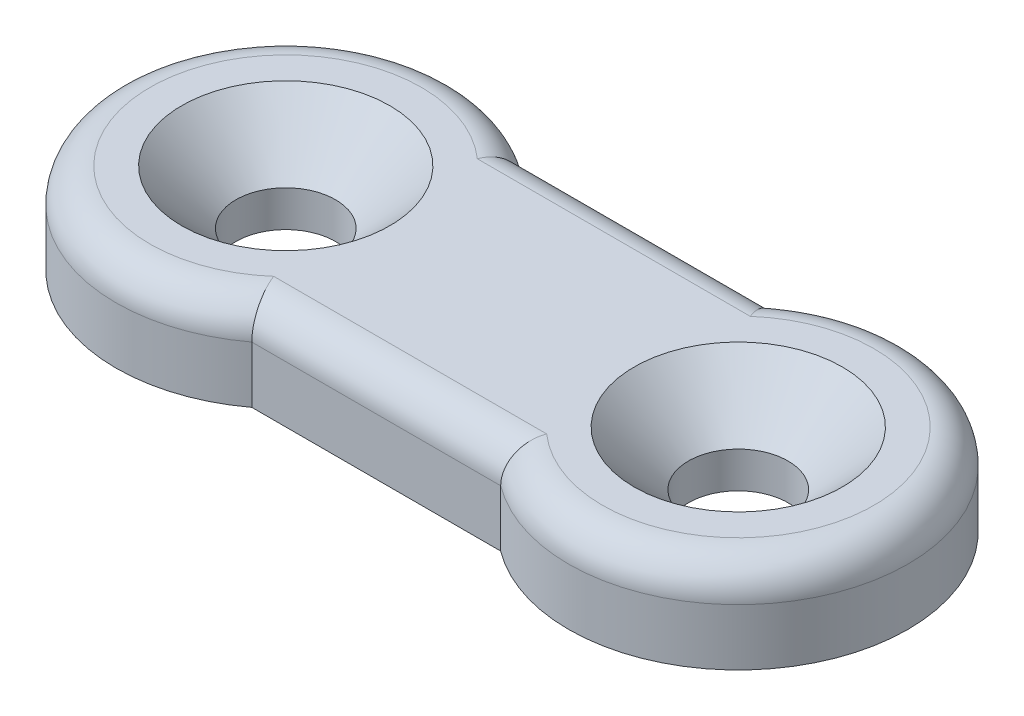
ISO-10303-21;
HEADER;
FILE_DESCRIPTION(('STEP AP214'),'2;1');
FILE_NAME('part.step','',(''),(''),'','','');
FILE_SCHEMA(('AUTOMOTIVE_DESIGN { 1 0 10303 214 1 1 1 1 }'));
ENDSEC;
DATA;
#1=APPLICATION_CONTEXT('core data for automotive mechanical design processes');
#2=APPLICATION_PROTOCOL_DEFINITION('international standard','automotive_design',2000,#1);
#3=PRODUCT_CONTEXT('',#1,'mechanical');
#4=PRODUCT('Part','Part','',(#3));
#5=PRODUCT_RELATED_PRODUCT_CATEGORY('part','',(#4));
#6=PRODUCT_DEFINITION_FORMATION('','',#4);
#7=PRODUCT_DEFINITION_CONTEXT('part definition',#1,'design');
#8=PRODUCT_DEFINITION('design','',#6,#7);
#9=PRODUCT_DEFINITION_SHAPE('','',#8);
#10=(LENGTH_UNIT() NAMED_UNIT(*) SI_UNIT(.MILLI.,.METRE.));
#11=(NAMED_UNIT(*) PLANE_ANGLE_UNIT() SI_UNIT($,.RADIAN.));
#12=(NAMED_UNIT(*) SI_UNIT($,.STERADIAN.) SOLID_ANGLE_UNIT());
#13=UNCERTAINTY_MEASURE_WITH_UNIT(LENGTH_MEASURE(1.E-05),#10,'distance_accuracy_value','');
#14=(GEOMETRIC_REPRESENTATION_CONTEXT(3) GLOBAL_UNCERTAINTY_ASSIGNED_CONTEXT((#13)) GLOBAL_UNIT_ASSIGNED_CONTEXT((#10,
#11,#12)) REPRESENTATION_CONTEXT('',''));
#15=CARTESIAN_POINT('',(0.,0.,0.));
#16=DIRECTION('',(0.,0.,1.));
#17=DIRECTION('',(1.,0.,0.));
#18=AXIS2_PLACEMENT_3D('',#15,#16,#17);
#19=CARTESIAN_POINT('',(-5.,2.,0.));
#20=DIRECTION('',(0.,1.,0.));
#21=DIRECTION('',(0.,0.,1.));
#22=AXIS2_PLACEMENT_3D('',#19,#20,#21);
#23=PLANE('',#22);
#24=CARTESIAN_POINT('',(-5.,2.,0.));
#25=DIRECTION('',(0.,1.,0.));
#26=DIRECTION('',(0.,0.,1.));
#27=AXIS2_PLACEMENT_3D('',#24,#25,#26);
#28=CIRCLE('',#27,3.);
#29=CARTESIAN_POINT('',(-3.01568651670156,2.,-2.25));
#30=VERTEX_POINT('',#29);
#31=CARTESIAN_POINT('',(-3.01568651670156,2.,2.25));
#32=VERTEX_POINT('',#31);
#33=EDGE_CURVE('E172',#30,#32,#28,.T.);
#34=ORIENTED_EDGE('',*,*,#33,.T.);
#35=DIRECTION('',(1.,0.,0.));
#36=VECTOR('',#35,1.);
#37=CARTESIAN_POINT('',(2.75,2.,2.25));
#38=LINE('',#37,#36);
#39=CARTESIAN_POINT('',(3.01568651670156,2.,2.25));
#40=VERTEX_POINT('',#39);
#41=EDGE_CURVE('E179',#32,#40,#38,.T.);
#42=ORIENTED_EDGE('',*,*,#41,.T.);
#43=CARTESIAN_POINT('',(5.,2.,0.));
#44=DIRECTION('',(0.,1.,0.));
#45=DIRECTION('',(0.,0.,1.));
#46=AXIS2_PLACEMENT_3D('',#43,#44,#45);
#47=CIRCLE('',#46,3.);
#48=CARTESIAN_POINT('',(3.01568651670156,2.,-2.25));
#49=VERTEX_POINT('',#48);
#50=EDGE_CURVE('E180',#40,#49,#47,.T.);
#51=ORIENTED_EDGE('',*,*,#50,.T.);
#52=DIRECTION('',(-1.,0.,0.));
#53=VECTOR('',#52,1.);
#54=CARTESIAN_POINT('',(-2.75,2.,-2.25));
#55=LINE('',#54,#53);
#56=EDGE_CURVE('E171',#49,#30,#55,.T.);
#57=ORIENTED_EDGE('',*,*,#56,.T.);
#58=EDGE_LOOP('',(#34,#42,#51,#57));
#59=FACE_BOUND('',#58,.T.);
#60=CARTESIAN_POINT('',(5.,2.,0.));
#61=DIRECTION('',(0.,1.,0.));
#62=DIRECTION('',(0.,0.,1.));
#63=AXIS2_PLACEMENT_3D('',#60,#61,#62);
#64=CIRCLE('',#63,2.3);
#65=CARTESIAN_POINT('',(5.,2.,2.3));
#66=VERTEX_POINT('',#65);
#67=EDGE_CURVE('E161',#66,#66,#64,.F.);
#68=ORIENTED_EDGE('',*,*,#67,.T.);
#69=EDGE_LOOP('',(#68));
#70=FACE_BOUND('',#69,.T.);
#71=CARTESIAN_POINT('',(-5.,2.,0.));
#72=DIRECTION('',(0.,1.,0.));
#73=DIRECTION('',(0.,0.,1.));
#74=AXIS2_PLACEMENT_3D('',#71,#72,#73);
#75=CIRCLE('',#74,2.3);
#76=CARTESIAN_POINT('',(-5.,2.,2.3));
#77=VERTEX_POINT('',#76);
#78=EDGE_CURVE('E157',#77,#77,#75,.F.);
#79=ORIENTED_EDGE('',*,*,#78,.T.);
#80=EDGE_LOOP('',(#79));
#81=FACE_BOUND('',#80,.T.);
#82=ADVANCED_FACE('F50',(#59,#70,#81),#23,.T.);
#83=CARTESIAN_POINT('',(-5.,0.,0.));
#84=DIRECTION('',(0.,1.,0.));
#85=DIRECTION('',(0.,0.,1.));
#86=AXIS2_PLACEMENT_3D('',#83,#84,#85);
#87=PLANE('',#86);
#88=DIRECTION('',(-1.,0.,0.));
#89=VECTOR('',#88,1.);
#90=CARTESIAN_POINT('',(-5.,0.,-3.));
#91=LINE('',#90,#89);
#92=CARTESIAN_POINT('',(2.75,0.,-3.));
#93=VERTEX_POINT('',#92);
#94=CARTESIAN_POINT('',(-2.75,0.,-3.));
#95=VERTEX_POINT('',#94);
#96=EDGE_CURVE('E110',#93,#95,#91,.T.);
#97=ORIENTED_EDGE('',*,*,#96,.F.);
#98=CARTESIAN_POINT('',(5.,0.,0.));
#99=DIRECTION('',(0.,1.,0.));
#100=DIRECTION('',(0.,0.,1.));
#101=AXIS2_PLACEMENT_3D('',#98,#99,#100);
#102=CIRCLE('',#101,3.75);
#103=CARTESIAN_POINT('',(2.75,0.,3.));
#104=VERTEX_POINT('',#103);
#105=EDGE_CURVE('E122',#93,#104,#102,.F.);
#106=ORIENTED_EDGE('',*,*,#105,.T.);
#107=DIRECTION('',(1.,0.,0.));
#108=VECTOR('',#107,1.);
#109=CARTESIAN_POINT('',(-5.,0.,3.));
#110=LINE('',#109,#108);
#111=CARTESIAN_POINT('',(-2.75,0.,3.));
#112=VERTEX_POINT('',#111);
#113=EDGE_CURVE('E123',#112,#104,#110,.T.);
#114=ORIENTED_EDGE('',*,*,#113,.F.);
#115=CARTESIAN_POINT('',(-5.,0.,0.));
#116=DIRECTION('',(0.,1.,0.));
#117=DIRECTION('',(0.,0.,1.));
#118=AXIS2_PLACEMENT_3D('',#115,#116,#117);
#119=CIRCLE('',#118,3.75);
#120=EDGE_CURVE('E124',#112,#95,#119,.F.);
#121=ORIENTED_EDGE('',*,*,#120,.T.);
#122=EDGE_LOOP('',(#97,#106,#114,#121));
#123=FACE_BOUND('',#122,.T.);
#124=CARTESIAN_POINT('',(-5.,0.,0.));
#125=DIRECTION('',(0.,1.,0.));
#126=DIRECTION('',(0.,0.,1.));
#127=AXIS2_PLACEMENT_3D('',#124,#125,#126);
#128=CIRCLE('',#127,1.1);
#129=CARTESIAN_POINT('',(-5.,0.,1.1));
#130=VERTEX_POINT('',#129);
#131=EDGE_CURVE('E150',#130,#130,#128,.T.);
#132=ORIENTED_EDGE('',*,*,#131,.T.);
#133=EDGE_LOOP('',(#132));
#134=FACE_BOUND('',#133,.T.);
#135=CARTESIAN_POINT('',(5.,0.,0.));
#136=DIRECTION('',(0.,1.,0.));
#137=DIRECTION('',(0.,0.,1.));
#138=AXIS2_PLACEMENT_3D('',#135,#136,#137);
#139=CIRCLE('',#138,1.1);
#140=CARTESIAN_POINT('',(5.,0.,1.1));
#141=VERTEX_POINT('',#140);
#142=EDGE_CURVE('E144',#141,#141,#139,.T.);
#143=ORIENTED_EDGE('',*,*,#142,.T.);
#144=EDGE_LOOP('',(#143));
#145=FACE_BOUND('',#144,.T.);
#146=ADVANCED_FACE('F117',(#123,#134,#145),#87,.F.);
#147=CARTESIAN_POINT('',(-5.,2.,3.));
#148=DIRECTION('',(0.,0.,-1.));
#149=DIRECTION('',(-1.,0.,0.));
#150=AXIS2_PLACEMENT_3D('',#147,#148,#149);
#151=PLANE('',#150);
#152=DIRECTION('',(0.,1.,0.));
#153=VECTOR('',#152,1.);
#154=CARTESIAN_POINT('',(2.75,-10.6066017177982,3.));
#155=LINE('',#154,#153);
#156=CARTESIAN_POINT('',(2.75,1.25,3.));
#157=VERTEX_POINT('',#156);
#158=EDGE_CURVE('E127',#104,#157,#155,.T.);
#159=ORIENTED_EDGE('',*,*,#158,.T.);
#160=DIRECTION('',(1.,0.,0.));
#161=VECTOR('',#160,1.);
#162=CARTESIAN_POINT('',(-2.75,1.25,3.));
#163=LINE('',#162,#161);
#164=CARTESIAN_POINT('',(-2.75,1.25,3.));
#165=VERTEX_POINT('',#164);
#166=EDGE_CURVE('E183',#157,#165,#163,.F.);
#167=ORIENTED_EDGE('',*,*,#166,.T.);
#168=DIRECTION('',(0.,1.,0.));
#169=VECTOR('',#168,1.);
#170=CARTESIAN_POINT('',(-2.75,-10.6066017177982,3.));
#171=LINE('',#170,#169);
#172=EDGE_CURVE('E142',#165,#112,#171,.F.);
#173=ORIENTED_EDGE('',*,*,#172,.T.);
#174=ORIENTED_EDGE('',*,*,#113,.T.);
#175=EDGE_LOOP('',(#159,#167,#173,#174));
#176=FACE_BOUND('',#175,.T.);
#177=ADVANCED_FACE('F232',(#176),#151,.F.);
#178=CARTESIAN_POINT('',(-5.,2.,-3.));
#179=DIRECTION('',(0.,0.,1.));
#180=DIRECTION('',(1.,0.,0.));
#181=AXIS2_PLACEMENT_3D('',#178,#179,#180);
#182=PLANE('',#181);
#183=DIRECTION('',(0.,1.,0.));
#184=VECTOR('',#183,1.);
#185=CARTESIAN_POINT('',(-2.75,-10.6066017177982,-3.));
#186=LINE('',#185,#184);
#187=CARTESIAN_POINT('',(-2.75,1.25,-3.));
#188=VERTEX_POINT('',#187);
#189=EDGE_CURVE('E113',#95,#188,#186,.T.);
#190=ORIENTED_EDGE('',*,*,#189,.T.);
#191=DIRECTION('',(-1.,0.,0.));
#192=VECTOR('',#191,1.);
#193=CARTESIAN_POINT('',(2.75,1.25,-3.));
#194=LINE('',#193,#192);
#195=CARTESIAN_POINT('',(2.75,1.25,-3.));
#196=VERTEX_POINT('',#195);
#197=EDGE_CURVE('E11',#188,#196,#194,.F.);
#198=ORIENTED_EDGE('',*,*,#197,.T.);
#199=DIRECTION('',(0.,1.,0.));
#200=VECTOR('',#199,1.);
#201=CARTESIAN_POINT('',(2.75,-10.6066017177982,-3.));
#202=LINE('',#201,#200);
#203=EDGE_CURVE('E104',#196,#93,#202,.F.);
#204=ORIENTED_EDGE('',*,*,#203,.T.);
#205=ORIENTED_EDGE('',*,*,#96,.T.);
#206=EDGE_LOOP('',(#190,#198,#204,#205));
#207=FACE_BOUND('',#206,.T.);
#208=ADVANCED_FACE('F106',(#207),#182,.F.);
#209=CARTESIAN_POINT('',(-5.,2.,0.));
#210=DIRECTION('',(0.,-1.,0.));
#211=DIRECTION('',(0.,0.,-1.));
#212=AXIS2_PLACEMENT_3D('',#209,#210,#211);
#213=CYLINDRICAL_SURFACE('',#212,1.1);
#214=CARTESIAN_POINT('',(-5.,0.800000000000006,0.));
#215=DIRECTION('',(0.,1.,0.));
#216=DIRECTION('',(0.,0.,1.));
#217=AXIS2_PLACEMENT_3D('',#214,#215,#216);
#218=CIRCLE('',#217,1.1);
#219=CARTESIAN_POINT('',(-5.,0.800000000000006,1.1));
#220=VERTEX_POINT('',#219);
#221=EDGE_CURVE('E170',#220,#220,#218,.T.);
#222=ORIENTED_EDGE('',*,*,#221,.T.);
#223=EDGE_LOOP('',(#222));
#224=FACE_BOUND('',#223,.T.);
#225=ORIENTED_EDGE('',*,*,#131,.F.);
#226=EDGE_LOOP('',(#225));
#227=FACE_BOUND('',#226,.T.);
#228=ADVANCED_FACE('F237',(#224,#227),#213,.F.);
#229=CARTESIAN_POINT('',(5.,2.,0.));
#230=DIRECTION('',(0.,-1.,0.));
#231=DIRECTION('',(0.,0.,-1.));
#232=AXIS2_PLACEMENT_3D('',#229,#230,#231);
#233=CYLINDRICAL_SURFACE('',#232,1.1);
#234=CARTESIAN_POINT('',(5.,0.800000000000006,0.));
#235=DIRECTION('',(0.,1.,0.));
#236=DIRECTION('',(0.,0.,1.));
#237=AXIS2_PLACEMENT_3D('',#234,#235,#236);
#238=CIRCLE('',#237,1.1);
#239=CARTESIAN_POINT('',(5.,0.800000000000006,1.1));
#240=VERTEX_POINT('',#239);
#241=EDGE_CURVE('E115',#240,#240,#238,.T.);
#242=ORIENTED_EDGE('',*,*,#241,.T.);
#243=EDGE_LOOP('',(#242));
#244=FACE_BOUND('',#243,.T.);
#245=ORIENTED_EDGE('',*,*,#142,.F.);
#246=EDGE_LOOP('',(#245));
#247=FACE_BOUND('',#246,.T.);
#248=ADVANCED_FACE('F262',(#244,#247),#233,.F.);
#249=CARTESIAN_POINT('',(-5.,-10.6066017177982,0.));
#250=DIRECTION('',(0.,1.,0.));
#251=DIRECTION('',(0.,0.,1.));
#252=AXIS2_PLACEMENT_3D('',#249,#250,#251);
#253=CYLINDRICAL_SURFACE('',#252,3.75);
#254=ORIENTED_EDGE('',*,*,#172,.F.);
#255=CARTESIAN_POINT('',(-5.,1.25,0.));
#256=DIRECTION('',(0.,1.,0.));
#257=DIRECTION('',(0.,0.,1.));
#258=AXIS2_PLACEMENT_3D('',#255,#256,#257);
#259=CIRCLE('',#258,3.75);
#260=EDGE_CURVE('E61',#165,#188,#259,.F.);
#261=ORIENTED_EDGE('',*,*,#260,.T.);
#262=ORIENTED_EDGE('',*,*,#189,.F.);
#263=ORIENTED_EDGE('',*,*,#120,.F.);
#264=EDGE_LOOP('',(#254,#261,#262,#263));
#265=FACE_BOUND('',#264,.T.);
#266=ADVANCED_FACE('F269',(#265),#253,.T.);
#267=CARTESIAN_POINT('',(5.,-10.6066017177982,0.));
#268=DIRECTION('',(0.,1.,0.));
#269=DIRECTION('',(0.,0.,1.));
#270=AXIS2_PLACEMENT_3D('',#267,#268,#269);
#271=CYLINDRICAL_SURFACE('',#270,3.75);
#272=ORIENTED_EDGE('',*,*,#203,.F.);
#273=CARTESIAN_POINT('',(5.,1.25,0.));
#274=DIRECTION('',(0.,1.,0.));
#275=DIRECTION('',(0.,0.,1.));
#276=AXIS2_PLACEMENT_3D('',#273,#274,#275);
#277=CIRCLE('',#276,3.75);
#278=EDGE_CURVE('E189',#196,#157,#277,.F.);
#279=ORIENTED_EDGE('',*,*,#278,.T.);
#280=ORIENTED_EDGE('',*,*,#158,.F.);
#281=ORIENTED_EDGE('',*,*,#105,.F.);
#282=EDGE_LOOP('',(#272,#279,#280,#281));
#283=FACE_BOUND('',#282,.T.);
#284=ADVANCED_FACE('F130',(#283),#271,.T.);
#285=CARTESIAN_POINT('',(5.,0.800000000000006,0.));
#286=DIRECTION('',(0.,1.,0.));
#287=DIRECTION('',(0.,0.,1.));
#288=AXIS2_PLACEMENT_3D('',#285,#286,#287);
#289=CONICAL_SURFACE('',#288,1.1,0.78539816339745);
#290=CARTESIAN_POINT('',(5.,2.,2.3));
#291=CARTESIAN_POINT('',(5.,1.9875,2.2875));
#292=CARTESIAN_POINT('',(5.,1.975,2.275));
#293=CARTESIAN_POINT('',(5.,1.95,2.25));
#294=CARTESIAN_POINT('',(5.,1.9375,2.2375));
#295=CARTESIAN_POINT('',(5.,1.9125,2.2125));
#296=CARTESIAN_POINT('',(5.,1.9,2.2));
#297=CARTESIAN_POINT('',(5.,1.875,2.175));
#298=CARTESIAN_POINT('',(5.,1.8625,2.1625));
#299=CARTESIAN_POINT('',(5.,1.8375,2.1375));
#300=CARTESIAN_POINT('',(5.,1.825,2.125));
#301=CARTESIAN_POINT('',(5.,1.8,2.1));
#302=CARTESIAN_POINT('',(5.,1.7875,2.0875));
#303=CARTESIAN_POINT('',(5.,1.7625,2.0625));
#304=CARTESIAN_POINT('',(5.,1.75,2.05));
#305=CARTESIAN_POINT('',(5.,1.725,2.025));
#306=CARTESIAN_POINT('',(5.,1.7125,2.0125));
#307=CARTESIAN_POINT('',(5.,1.6875,1.9875));
#308=CARTESIAN_POINT('',(5.,1.675,1.975));
#309=CARTESIAN_POINT('',(5.,1.65,1.95));
#310=CARTESIAN_POINT('',(5.,1.6375,1.9375));
#311=CARTESIAN_POINT('',(5.,1.6125,1.9125));
#312=CARTESIAN_POINT('',(5.,1.6,1.9));
#313=CARTESIAN_POINT('',(5.,1.575,1.875));
#314=CARTESIAN_POINT('',(5.,1.5625,1.8625));
#315=CARTESIAN_POINT('',(5.,1.5375,1.8375));
#316=CARTESIAN_POINT('',(5.,1.525,1.825));
#317=CARTESIAN_POINT('',(5.,1.5,1.8));
#318=CARTESIAN_POINT('',(5.,1.4875,1.7875));
#319=CARTESIAN_POINT('',(5.,1.4625,1.7625));
#320=CARTESIAN_POINT('',(5.,1.45,1.75));
#321=CARTESIAN_POINT('',(5.,1.425,1.725));
#322=CARTESIAN_POINT('',(5.,1.4125,1.7125));
#323=CARTESIAN_POINT('',(5.,1.3875,1.6875));
#324=CARTESIAN_POINT('',(5.,1.375,1.675));
#325=CARTESIAN_POINT('',(5.,1.35,1.65));
#326=CARTESIAN_POINT('',(5.,1.3375,1.6375));
#327=CARTESIAN_POINT('',(5.,1.3125,1.6125));
#328=CARTESIAN_POINT('',(5.,1.3,1.6));
#329=CARTESIAN_POINT('',(5.,1.275,1.575));
#330=CARTESIAN_POINT('',(5.,1.2625,1.5625));
#331=CARTESIAN_POINT('',(5.,1.2375,1.5375));
#332=CARTESIAN_POINT('',(5.,1.225,1.525));
#333=CARTESIAN_POINT('',(5.,1.2,1.5));
#334=CARTESIAN_POINT('',(5.,1.1875,1.4875));
#335=CARTESIAN_POINT('',(5.,1.1625,1.4625));
#336=CARTESIAN_POINT('',(5.,1.15,1.45));
#337=CARTESIAN_POINT('',(5.,1.125,1.425));
#338=CARTESIAN_POINT('',(5.,1.1125,1.4125));
#339=CARTESIAN_POINT('',(5.,1.0875,1.3875));
#340=CARTESIAN_POINT('',(5.,1.075,1.375));
#341=CARTESIAN_POINT('',(5.,1.05,1.35));
#342=CARTESIAN_POINT('',(5.,1.0375,1.3375));
#343=CARTESIAN_POINT('',(5.,1.0125,1.3125));
#344=CARTESIAN_POINT('',(5.,1.,1.3));
#345=CARTESIAN_POINT('',(5.,0.975000000000005,1.275));
#346=CARTESIAN_POINT('',(5.,0.962500000000005,1.2625));
#347=CARTESIAN_POINT('',(5.,0.937500000000005,1.2375));
#348=CARTESIAN_POINT('',(5.,0.925000000000005,1.225));
#349=CARTESIAN_POINT('',(5.,0.900000000000005,1.2));
#350=CARTESIAN_POINT('',(5.,0.887500000000005,1.1875));
#351=CARTESIAN_POINT('',(5.,0.862500000000005,1.1625));
#352=CARTESIAN_POINT('',(5.,0.850000000000005,1.15));
#353=CARTESIAN_POINT('',(5.,0.825000000000005,1.125));
#354=CARTESIAN_POINT('',(5.,0.812500000000005,1.1125));
#355=CARTESIAN_POINT('',(5.,0.800000000000006,1.1));
#356=B_SPLINE_CURVE_WITH_KNOTS('',3,(#290,#291,#292,#293,#294,#295,#296,#297,#298,#299,#300,
#301,#302,#303,#304,#305,#306,#307,#308,#309,#310,#311,#312,#313,#314,#315,#316,#317,#318,#319,
#320,#321,#322,#323,#324,#325,#326,#327,#328,#329,#330,#331,#332,#333,#334,#335,#336,#337,#338,
#339,#340,#341,#342,#343,#344,#345,#346,#347,#348,#349,#350,#351,#352,#353,#354,#355),
.UNSPECIFIED.,.F.,.F.,(4,2,2,2,2,2,2,2,2,2,2,2,2,2,2,2,2,2,2,2,2,2,2,2,2,2,2,2,2,2,2,2,4),(0.,
0.0530330085889911,0.106066017177982,0.159099025766973,0.212132034355964,0.265165042944954,
0.318198051533945,0.371231060122936,0.424264068711927,0.477297077300918,0.530330085889909,
0.5833630944789,0.636396103067891,0.689429111656881,0.742462120245872,0.795495128834863,
0.848528137423854,0.901561146012845,0.954594154601836,1.00762716319083,1.06066017177982,
1.11369318036881,1.1667261889578,1.21975919754679,1.27279220613578,1.32582521472477,
1.37885822331376,1.43189123190275,1.48492424049174,1.53795724908074,1.59099025766973,
1.64402326625872,1.69705627484771),.UNSPECIFIED.);
#357=EDGE_CURVE('BSEAM250',#66,#240,#356,.T.);
#358=ORIENTED_EDGE('',*,*,#67,.F.);
#359=ORIENTED_EDGE('',*,*,#241,.F.);
#360=ORIENTED_EDGE('',*,*,#357,.T.);
#361=ORIENTED_EDGE('',*,*,#357,.F.);
#362=EDGE_LOOP('',(#358,#360,#359,#361));
#363=FACE_BOUND('',#362,.T.);
#364=ADVANCED_FACE('F250',(#363),#289,.F.);
#365=CARTESIAN_POINT('',(-5.,0.800000000000006,0.));
#366=DIRECTION('',(0.,1.,0.));
#367=DIRECTION('',(0.,0.,1.));
#368=AXIS2_PLACEMENT_3D('',#365,#366,#367);
#369=CONICAL_SURFACE('',#368,1.1,0.78539816339745);
#370=CARTESIAN_POINT('',(-5.,2.,2.3));
#371=CARTESIAN_POINT('',(-5.,1.9875,2.2875));
#372=CARTESIAN_POINT('',(-5.,1.975,2.275));
#373=CARTESIAN_POINT('',(-5.,1.95,2.25));
#374=CARTESIAN_POINT('',(-5.,1.9375,2.2375));
#375=CARTESIAN_POINT('',(-5.,1.9125,2.2125));
#376=CARTESIAN_POINT('',(-5.,1.9,2.2));
#377=CARTESIAN_POINT('',(-5.,1.875,2.175));
#378=CARTESIAN_POINT('',(-5.,1.8625,2.1625));
#379=CARTESIAN_POINT('',(-5.,1.8375,2.1375));
#380=CARTESIAN_POINT('',(-5.,1.825,2.125));
#381=CARTESIAN_POINT('',(-5.,1.8,2.1));
#382=CARTESIAN_POINT('',(-5.,1.7875,2.0875));
#383=CARTESIAN_POINT('',(-5.,1.7625,2.0625));
#384=CARTESIAN_POINT('',(-5.,1.75,2.05));
#385=CARTESIAN_POINT('',(-5.,1.725,2.025));
#386=CARTESIAN_POINT('',(-5.,1.7125,2.0125));
#387=CARTESIAN_POINT('',(-5.,1.6875,1.9875));
#388=CARTESIAN_POINT('',(-5.,1.675,1.975));
#389=CARTESIAN_POINT('',(-5.,1.65,1.95));
#390=CARTESIAN_POINT('',(-5.,1.6375,1.9375));
#391=CARTESIAN_POINT('',(-5.,1.6125,1.9125));
#392=CARTESIAN_POINT('',(-5.,1.6,1.9));
#393=CARTESIAN_POINT('',(-5.,1.575,1.875));
#394=CARTESIAN_POINT('',(-5.,1.5625,1.8625));
#395=CARTESIAN_POINT('',(-5.,1.5375,1.8375));
#396=CARTESIAN_POINT('',(-5.,1.525,1.825));
#397=CARTESIAN_POINT('',(-5.,1.5,1.8));
#398=CARTESIAN_POINT('',(-5.,1.4875,1.7875));
#399=CARTESIAN_POINT('',(-5.,1.4625,1.7625));
#400=CARTESIAN_POINT('',(-5.,1.45,1.75));
#401=CARTESIAN_POINT('',(-5.,1.425,1.725));
#402=CARTESIAN_POINT('',(-5.,1.4125,1.7125));
#403=CARTESIAN_POINT('',(-5.,1.3875,1.6875));
#404=CARTESIAN_POINT('',(-5.,1.375,1.675));
#405=CARTESIAN_POINT('',(-5.,1.35,1.65));
#406=CARTESIAN_POINT('',(-5.,1.3375,1.6375));
#407=CARTESIAN_POINT('',(-5.,1.3125,1.6125));
#408=CARTESIAN_POINT('',(-5.,1.3,1.6));
#409=CARTESIAN_POINT('',(-5.,1.275,1.575));
#410=CARTESIAN_POINT('',(-5.,1.2625,1.5625));
#411=CARTESIAN_POINT('',(-5.,1.2375,1.5375));
#412=CARTESIAN_POINT('',(-5.,1.225,1.525));
#413=CARTESIAN_POINT('',(-5.,1.2,1.5));
#414=CARTESIAN_POINT('',(-5.,1.1875,1.4875));
#415=CARTESIAN_POINT('',(-5.,1.1625,1.4625));
#416=CARTESIAN_POINT('',(-5.,1.15,1.45));
#417=CARTESIAN_POINT('',(-5.,1.125,1.425));
#418=CARTESIAN_POINT('',(-5.,1.1125,1.4125));
#419=CARTESIAN_POINT('',(-5.,1.0875,1.3875));
#420=CARTESIAN_POINT('',(-5.,1.075,1.375));
#421=CARTESIAN_POINT('',(-5.,1.05,1.35));
#422=CARTESIAN_POINT('',(-5.,1.0375,1.3375));
#423=CARTESIAN_POINT('',(-5.,1.0125,1.3125));
#424=CARTESIAN_POINT('',(-5.,1.,1.3));
#425=CARTESIAN_POINT('',(-5.,0.975000000000005,1.275));
#426=CARTESIAN_POINT('',(-5.,0.962500000000005,1.2625));
#427=CARTESIAN_POINT('',(-5.,0.937500000000005,1.2375));
#428=CARTESIAN_POINT('',(-5.,0.925000000000005,1.225));
#429=CARTESIAN_POINT('',(-5.,0.900000000000005,1.2));
#430=CARTESIAN_POINT('',(-5.,0.887500000000005,1.1875));
#431=CARTESIAN_POINT('',(-5.,0.862500000000005,1.1625));
#432=CARTESIAN_POINT('',(-5.,0.850000000000005,1.15));
#433=CARTESIAN_POINT('',(-5.,0.825000000000005,1.125));
#434=CARTESIAN_POINT('',(-5.,0.812500000000005,1.1125));
#435=CARTESIAN_POINT('',(-5.,0.800000000000006,1.1));
#436=B_SPLINE_CURVE_WITH_KNOTS('',3,(#370,#371,#372,#373,#374,#375,#376,#377,#378,#379,#380,
#381,#382,#383,#384,#385,#386,#387,#388,#389,#390,#391,#392,#393,#394,#395,#396,#397,#398,#399,
#400,#401,#402,#403,#404,#405,#406,#407,#408,#409,#410,#411,#412,#413,#414,#415,#416,#417,#418,
#419,#420,#421,#422,#423,#424,#425,#426,#427,#428,#429,#430,#431,#432,#433,#434,#435),
.UNSPECIFIED.,.F.,.F.,(4,2,2,2,2,2,2,2,2,2,2,2,2,2,2,2,2,2,2,2,2,2,2,2,2,2,2,2,2,2,2,2,4),(0.,
0.0530330085889911,0.106066017177982,0.159099025766973,0.212132034355964,0.265165042944954,
0.318198051533945,0.371231060122936,0.424264068711927,0.477297077300918,0.530330085889909,
0.5833630944789,0.636396103067891,0.689429111656881,0.742462120245872,0.795495128834863,
0.848528137423854,0.901561146012845,0.954594154601836,1.00762716319083,1.06066017177982,
1.11369318036881,1.1667261889578,1.21975919754679,1.27279220613578,1.32582521472477,
1.37885822331376,1.43189123190275,1.48492424049174,1.53795724908074,1.59099025766973,
1.64402326625872,1.69705627484771),.UNSPECIFIED.);
#437=EDGE_CURVE('BSEAM224',#77,#220,#436,.T.);
#438=ORIENTED_EDGE('',*,*,#78,.F.);
#439=ORIENTED_EDGE('',*,*,#221,.F.);
#440=ORIENTED_EDGE('',*,*,#437,.T.);
#441=ORIENTED_EDGE('',*,*,#437,.F.);
#442=EDGE_LOOP('',(#438,#440,#439,#441));
#443=FACE_BOUND('',#442,.T.);
#444=ADVANCED_FACE('F224',(#443),#369,.F.);
#445=CARTESIAN_POINT('',(-5.,1.25,-2.25));
#446=DIRECTION('',(1.,0.,0.));
#447=DIRECTION('',(0.,0.,-1.));
#448=AXIS2_PLACEMENT_3D('',#445,#446,#447);
#449=CYLINDRICAL_SURFACE('',#448,0.75);
#450=CARTESIAN_POINT('',(2.75,1.25,-3.));
#451=CARTESIAN_POINT('',(2.74998905867986,1.29058370267292,-3.00004243921257));
#452=CARTESIAN_POINT('',(2.75109713085981,1.33114529022068,-2.99670875961219));
#453=CARTESIAN_POINT('',(2.75546644333195,1.41101579539589,-2.98361488319819));
#454=CARTESIAN_POINT('',(2.75872324746991,1.45032711934631,-2.97386792699618));
#455=CARTESIAN_POINT('',(2.76730587110689,1.52666568608426,-2.94827055562628));
#456=CARTESIAN_POINT('',(2.77263172990519,1.56369288547203,-2.93242002452812));
#457=CARTESIAN_POINT('',(2.78520469459627,1.63449261602701,-2.89518571716089));
#458=CARTESIAN_POINT('',(2.79245208326654,1.66826466715965,-2.87380112649587));
#459=CARTESIAN_POINT('',(2.80884708274731,1.73237133829751,-2.82572187690543));
#460=CARTESIAN_POINT('',(2.81802994112287,1.76262327796004,-2.79892917742853));
#461=CARTESIAN_POINT('',(2.8379774551548,1.81821509340858,-2.74116140298337));
#462=CARTESIAN_POINT('',(2.84874260526331,1.8435534279751,-2.71018502089771));
#463=CARTESIAN_POINT('',(2.87216355429324,1.88992120913573,-2.6433629125557));
#464=CARTESIAN_POINT('',(2.88488587990576,1.91068084939849,-2.60735355148422));
#465=CARTESIAN_POINT('',(2.91150109049323,1.94587556943367,-2.53276728278516));
#466=CARTESIAN_POINT('',(2.92539408598144,1.96031005130094,-2.49419013282624));
#467=CARTESIAN_POINT('',(2.95152433091159,1.98069513075811,-2.42240841352011));
#468=CARTESIAN_POINT('',(2.96362641587813,1.98768775946418,-2.38944366611599));
#469=CARTESIAN_POINT('',(2.98822235104004,1.99718251635412,-2.32306580191279));
#470=CARTESIAN_POINT('',(3.00071542413897,1.99969303954343,-2.28965364168525));
#471=CARTESIAN_POINT('',(3.01409959258152,1.999991201465,-2.25419985845682));
#472=CARTESIAN_POINT('',(3.01489287347166,2.00000002191533,-2.25209977376721));
#473=CARTESIAN_POINT('',(3.01568651670156,2.,-2.25));
#474=B_SPLINE_CURVE_WITH_KNOTS('',3,(#450,#451,#452,#453,#454,#455,#456,#457,#458,#459,#460,
#461,#462,#463,#464,#465,#466,#467,#468,#469,#470,#471,#472,#473),.UNSPECIFIED.,.F.,.F.,(4,2,2,
2,2,2,2,2,2,2,2,4),(0.,0.121565492442729,0.242880789514633,0.36419839094234,0.485533855712512,
0.609306739354865,0.733118383482231,0.862957257731765,0.992808402756185,1.09995800456309,
1.20690670325669,1.21364142216533),.UNSPECIFIED.);
#475=EDGE_CURVE('E140',#196,#49,#474,.T.);
#476=ORIENTED_EDGE('',*,*,#475,.F.);
#477=ORIENTED_EDGE('',*,*,#197,.F.);
#478=CARTESIAN_POINT('',(-2.75,1.25,-3.));
#479=CARTESIAN_POINT('',(-2.74998905867986,1.29058370267292,-3.00004243921257));
#480=CARTESIAN_POINT('',(-2.75109713085981,1.33114529022068,-2.99670875961219));
#481=CARTESIAN_POINT('',(-2.75546644333195,1.41101579539589,-2.98361488319819));
#482=CARTESIAN_POINT('',(-2.75872324746991,1.45032711934631,-2.97386792699618));
#483=CARTESIAN_POINT('',(-2.76730587110689,1.52666568608426,-2.94827055562628));
#484=CARTESIAN_POINT('',(-2.77263172990519,1.56369288547203,-2.93242002452812));
#485=CARTESIAN_POINT('',(-2.78520469459628,1.63449261602701,-2.89518571716089));
#486=CARTESIAN_POINT('',(-2.79245208326654,1.66826466715965,-2.87380112649587));
#487=CARTESIAN_POINT('',(-2.80884708274732,1.73237133829751,-2.82572187690543));
#488=CARTESIAN_POINT('',(-2.81802994112287,1.76262327796004,-2.79892917742853));
#489=CARTESIAN_POINT('',(-2.8379774551548,1.81821509340858,-2.74116140298336));
#490=CARTESIAN_POINT('',(-2.84874260526331,1.84355342797509,-2.71018502089771));
#491=CARTESIAN_POINT('',(-2.87216355429324,1.88992120913573,-2.6433629125557));
#492=CARTESIAN_POINT('',(-2.88488587990576,1.91068084939849,-2.60735355148422));
#493=CARTESIAN_POINT('',(-2.91150109049323,1.94587556943367,-2.53276728278516));
#494=CARTESIAN_POINT('',(-2.92539408598143,1.96031005130094,-2.49419013282624));
#495=CARTESIAN_POINT('',(-2.9515243309116,1.98069513075811,-2.42240841352011));
#496=CARTESIAN_POINT('',(-2.96362641587815,1.98768775946418,-2.389443666116));
#497=CARTESIAN_POINT('',(-2.98822235104002,1.99718251635412,-2.32306580191278));
#498=CARTESIAN_POINT('',(-3.00071542413891,1.99969303954343,-2.28965364168523));
#499=CARTESIAN_POINT('',(-3.01409959258152,1.999991201465,-2.25419985845682));
#500=CARTESIAN_POINT('',(-3.01489287347166,2.00000002191533,-2.25209977376721));
#501=CARTESIAN_POINT('',(-3.01568651670156,2.,-2.25));
#502=B_SPLINE_CURVE_WITH_KNOTS('',3,(#478,#479,#480,#481,#482,#483,#484,#485,#486,#487,#488,
#489,#490,#491,#492,#493,#494,#495,#496,#497,#498,#499,#500,#501),.UNSPECIFIED.,.F.,.F.,(4,2,2,
2,2,2,2,2,2,2,2,4),(0.,0.121565492442729,0.242880789514633,0.36419839094234,0.485533855712512,
0.609306739354865,0.733118383482231,0.862957257731765,0.992808402756185,1.09995800456309,
1.20690670325669,1.21364142216533),.UNSPECIFIED.);
#503=EDGE_CURVE('E55',#30,#188,#502,.F.);
#504=ORIENTED_EDGE('',*,*,#503,.F.);
#505=ORIENTED_EDGE('',*,*,#56,.F.);
#506=EDGE_LOOP('',(#476,#477,#504,#505));
#507=FACE_BOUND('',#506,.T.);
#508=ADVANCED_FACE('F47',(#507),#449,.T.);
#509=CARTESIAN_POINT('',(-5.,1.25,0.));
#510=DIRECTION('',(0.,1.,0.));
#511=DIRECTION('',(0.,0.,1.));
#512=AXIS2_PLACEMENT_3D('',#509,#510,#511);
#513=TOROIDAL_SURFACE('',#512,3.,0.75);
#514=ORIENTED_EDGE('',*,*,#503,.T.);
#515=ORIENTED_EDGE('',*,*,#260,.F.);
#516=CARTESIAN_POINT('',(-2.75,1.25,3.));
#517=CARTESIAN_POINT('',(-2.74998905867986,1.29058370267292,3.00004243921257));
#518=CARTESIAN_POINT('',(-2.75109713085981,1.33114529022068,2.99670875961218));
#519=CARTESIAN_POINT('',(-2.75546644333195,1.41101579539589,2.98361488319819));
#520=CARTESIAN_POINT('',(-2.75872324746991,1.45032711934631,2.97386792699618));
#521=CARTESIAN_POINT('',(-2.76730587110689,1.52666568608426,2.94827055562628));
#522=CARTESIAN_POINT('',(-2.77263172990519,1.56369288547203,2.93242002452812));
#523=CARTESIAN_POINT('',(-2.78520469459627,1.63449261602701,2.89518571716089));
#524=CARTESIAN_POINT('',(-2.79245208326654,1.66826466715965,2.87380112649587));
#525=CARTESIAN_POINT('',(-2.80884708274731,1.73237133829751,2.82572187690543));
#526=CARTESIAN_POINT('',(-2.81802994112287,1.76262327796004,2.79892917742853));
#527=CARTESIAN_POINT('',(-2.8379774551548,1.81821509340858,2.74116140298336));
#528=CARTESIAN_POINT('',(-2.84874260526331,1.84355342797509,2.71018502089771));
#529=CARTESIAN_POINT('',(-2.87216355429324,1.88992120913573,2.64336291255569));
#530=CARTESIAN_POINT('',(-2.88488587990576,1.91068084939849,2.60735355148422));
#531=CARTESIAN_POINT('',(-2.91150109049324,1.94587556943367,2.53276728278516));
#532=CARTESIAN_POINT('',(-2.92539408598144,1.96031005130094,2.49419013282624));
#533=CARTESIAN_POINT('',(-2.95152433091159,1.98069513075811,2.4224084135201));
#534=CARTESIAN_POINT('',(-2.96362641587813,1.98768775946418,2.38944366611599));
#535=CARTESIAN_POINT('',(-2.98822235104004,1.99718251635412,2.32306580191279));
#536=CARTESIAN_POINT('',(-3.00071542413898,1.99969303954343,2.28965364168525));
#537=CARTESIAN_POINT('',(-3.01409959258152,1.999991201465,2.25419985845682));
#538=CARTESIAN_POINT('',(-3.01489287347166,2.00000002191533,2.25209977376721));
#539=CARTESIAN_POINT('',(-3.01568651670156,2.,2.25));
#540=B_SPLINE_CURVE_WITH_KNOTS('',3,(#516,#517,#518,#519,#520,#521,#522,#523,#524,#525,#526,
#527,#528,#529,#530,#531,#532,#533,#534,#535,#536,#537,#538,#539),.UNSPECIFIED.,.F.,.F.,(4,2,2,
2,2,2,2,2,2,2,2,4),(0.,0.12156549244273,0.242880789514633,0.364198390942341,0.485533855712512,
0.609306739354865,0.733118383482231,0.862957257731766,0.992808402756185,1.09995800456309,
1.20690670325669,1.21364142216533),.UNSPECIFIED.);
#541=EDGE_CURVE('E205',#32,#165,#540,.F.);
#542=ORIENTED_EDGE('',*,*,#541,.F.);
#543=ORIENTED_EDGE('',*,*,#33,.F.);
#544=EDGE_LOOP('',(#514,#515,#542,#543));
#545=FACE_BOUND('',#544,.T.);
#546=ADVANCED_FACE('F213',(#545),#513,.T.);
#547=CARTESIAN_POINT('',(5.,1.25,0.));
#548=DIRECTION('',(0.,1.,0.));
#549=DIRECTION('',(0.,0.,1.));
#550=AXIS2_PLACEMENT_3D('',#547,#548,#549);
#551=TOROIDAL_SURFACE('',#550,3.,0.75);
#552=ORIENTED_EDGE('',*,*,#475,.T.);
#553=ORIENTED_EDGE('',*,*,#50,.F.);
#554=CARTESIAN_POINT('',(2.75,1.25,3.));
#555=CARTESIAN_POINT('',(2.74998905867986,1.29058370267292,3.00004243921256));
#556=CARTESIAN_POINT('',(2.75109713085981,1.33114529022068,2.99670875961218));
#557=CARTESIAN_POINT('',(2.75546644333195,1.41101579539589,2.98361488319819));
#558=CARTESIAN_POINT('',(2.75872324746991,1.45032711934631,2.97386792699618));
#559=CARTESIAN_POINT('',(2.76730587110689,1.52666568608426,2.94827055562627));
#560=CARTESIAN_POINT('',(2.77263172990519,1.56369288547203,2.93242002452812));
#561=CARTESIAN_POINT('',(2.78520469459628,1.63449261602701,2.89518571716089));
#562=CARTESIAN_POINT('',(2.79245208326654,1.66826466715965,2.87380112649586));
#563=CARTESIAN_POINT('',(2.80884708274732,1.73237133829751,2.82572187690543));
#564=CARTESIAN_POINT('',(2.81802994112287,1.76262327796004,2.79892917742853));
#565=CARTESIAN_POINT('',(2.8379774551548,1.81821509340858,2.74116140298336));
#566=CARTESIAN_POINT('',(2.84874260526331,1.84355342797509,2.71018502089771));
#567=CARTESIAN_POINT('',(2.87216355429324,1.88992120913573,2.64336291255569));
#568=CARTESIAN_POINT('',(2.88488587990576,1.91068084939849,2.60735355148422));
#569=CARTESIAN_POINT('',(2.91150109049323,1.94587556943367,2.53276728278516));
#570=CARTESIAN_POINT('',(2.92539408598143,1.96031005130094,2.49419013282624));
#571=CARTESIAN_POINT('',(2.9515243309116,1.98069513075811,2.4224084135201));
#572=CARTESIAN_POINT('',(2.96362641587814,1.98768775946418,2.389443666116));
#573=CARTESIAN_POINT('',(2.98822235104003,1.99718251635412,2.32306580191278));
#574=CARTESIAN_POINT('',(3.00071542413892,1.99969303954343,2.28965364168523));
#575=CARTESIAN_POINT('',(3.01409959258152,1.999991201465,2.25419985845682));
#576=CARTESIAN_POINT('',(3.01489287347166,2.00000002191533,2.2520997737672));
#577=CARTESIAN_POINT('',(3.01568651670156,2.,2.25));
#578=B_SPLINE_CURVE_WITH_KNOTS('',3,(#554,#555,#556,#557,#558,#559,#560,#561,#562,#563,#564,
#565,#566,#567,#568,#569,#570,#571,#572,#573,#574,#575,#576,#577),.UNSPECIFIED.,.F.,.F.,(4,2,2,
2,2,2,2,2,2,2,2,4),(0.,0.121565492442729,0.242880789514633,0.36419839094234,0.485533855712512,
0.609306739354865,0.733118383482231,0.862957257731765,0.992808402756185,1.09995800456309,
1.20690670325669,1.21364142216533),.UNSPECIFIED.);
#579=EDGE_CURVE('E195',#157,#40,#578,.T.);
#580=ORIENTED_EDGE('',*,*,#579,.F.);
#581=ORIENTED_EDGE('',*,*,#278,.F.);
#582=EDGE_LOOP('',(#552,#553,#580,#581));
#583=FACE_BOUND('',#582,.T.);
#584=ADVANCED_FACE('F210',(#583),#551,.T.);
#585=CARTESIAN_POINT('',(-5.,1.25,2.25));
#586=DIRECTION('',(-1.,0.,0.));
#587=DIRECTION('',(0.,0.,1.));
#588=AXIS2_PLACEMENT_3D('',#585,#586,#587);
#589=CYLINDRICAL_SURFACE('',#588,0.75);
#590=ORIENTED_EDGE('',*,*,#541,.T.);
#591=ORIENTED_EDGE('',*,*,#166,.F.);
#592=ORIENTED_EDGE('',*,*,#579,.T.);
#593=ORIENTED_EDGE('',*,*,#41,.F.);
#594=EDGE_LOOP('',(#590,#591,#592,#593));
#595=FACE_BOUND('',#594,.T.);
#596=ADVANCED_FACE('F208',(#595),#589,.T.);
#597=CLOSED_SHELL('',(#82,#146,#177,#208,#228,#248,#266,#284,#364,#444,#508,#546,#584,#596));
#598=MANIFOLD_SOLID_BREP('B2',#597);
#599=ADVANCED_BREP_SHAPE_REPRESENTATION('',(#18,#598),#14);
#600=SHAPE_DEFINITION_REPRESENTATION(#9,#599);
ENDSEC;
END-ISO-10303-21;
